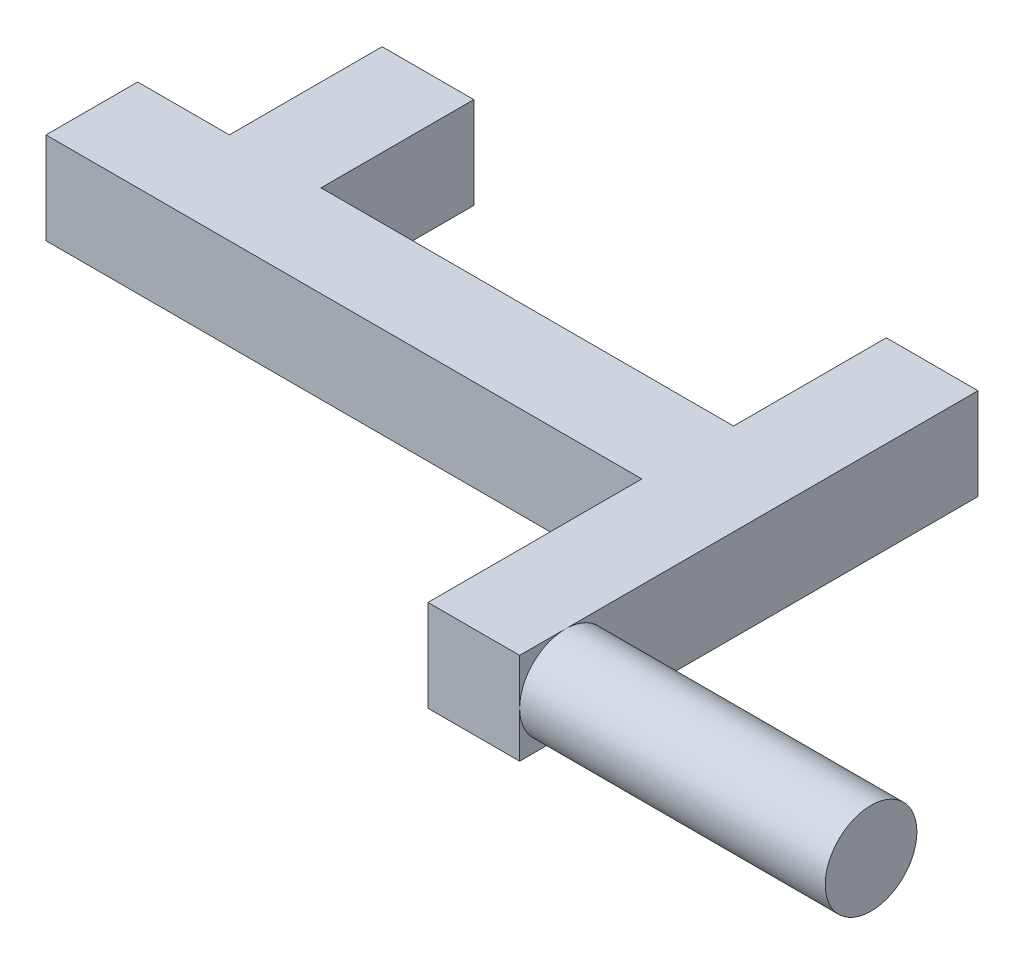
ISO-10303-21;
HEADER;
FILE_DESCRIPTION(('STEP AP214'),'2;1');
FILE_NAME('part.step','',(''),(''),'','','');
FILE_SCHEMA(('AUTOMOTIVE_DESIGN { 1 0 10303 214 1 1 1 1 }'));
ENDSEC;
DATA;
#1=APPLICATION_CONTEXT('core data for automotive mechanical design processes');
#2=APPLICATION_PROTOCOL_DEFINITION('international standard','automotive_design',2000,#1);
#3=PRODUCT_CONTEXT('',#1,'mechanical');
#4=PRODUCT('Part','Part','',(#3));
#5=PRODUCT_RELATED_PRODUCT_CATEGORY('part','',(#4));
#6=PRODUCT_DEFINITION_FORMATION('','',#4);
#7=PRODUCT_DEFINITION_CONTEXT('part definition',#1,'design');
#8=PRODUCT_DEFINITION('design','',#6,#7);
#9=PRODUCT_DEFINITION_SHAPE('','',#8);
#10=(LENGTH_UNIT() NAMED_UNIT(*) SI_UNIT(.MILLI.,.METRE.));
#11=(NAMED_UNIT(*) PLANE_ANGLE_UNIT() SI_UNIT($,.RADIAN.));
#12=(NAMED_UNIT(*) SI_UNIT($,.STERADIAN.) SOLID_ANGLE_UNIT());
#13=UNCERTAINTY_MEASURE_WITH_UNIT(LENGTH_MEASURE(1.E-05),#10,'distance_accuracy_value','');
#14=(GEOMETRIC_REPRESENTATION_CONTEXT(3) GLOBAL_UNCERTAINTY_ASSIGNED_CONTEXT((#13)) GLOBAL_UNIT_ASSIGNED_CONTEXT((#10,
#11,#12)) REPRESENTATION_CONTEXT('',''));
#15=CARTESIAN_POINT('',(0.,0.,0.));
#16=DIRECTION('',(0.,0.,1.));
#17=DIRECTION('',(1.,0.,0.));
#18=AXIS2_PLACEMENT_3D('',#15,#16,#17);
#19=CARTESIAN_POINT('',(71.,6.,0.));
#20=DIRECTION('',(1.,0.,0.));
#21=DIRECTION('',(0.,0.,-1.));
#22=AXIS2_PLACEMENT_3D('',#19,#20,#21);
#23=PLANE('',#22);
#24=CARTESIAN_POINT('',(71.,3.,27.));
#25=DIRECTION('',(1.,0.,0.));
#26=DIRECTION('',(0.,0.,-1.));
#27=AXIS2_PLACEMENT_3D('',#24,#25,#26);
#28=CIRCLE('',#27,3.);
#29=CARTESIAN_POINT('',(71.,3.,24.));
#30=VERTEX_POINT('',#29);
#31=EDGE_CURVE('E328',#30,#30,#28,.T.);
#32=ORIENTED_EDGE('',*,*,#31,.T.);
#33=EDGE_LOOP('',(#32));
#34=FACE_BOUND('',#33,.T.);
#35=ADVANCED_FACE('F107',(#34),#23,.T.);
#36=CARTESIAN_POINT('',(0.,6.,30.));
#37=DIRECTION('',(0.,0.,1.));
#38=DIRECTION('',(1.,0.,0.));
#39=AXIS2_PLACEMENT_3D('',#36,#37,#38);
#40=PLANE('',#39);
#41=DIRECTION('',(-1.,0.,0.));
#42=VECTOR('',#41,1.);
#43=CARTESIAN_POINT('',(0.,0.,30.));
#44=LINE('',#43,#42);
#45=CARTESIAN_POINT('',(51.,0.,30.));
#46=VERTEX_POINT('',#45);
#47=CARTESIAN_POINT('',(45.,0.,30.));
#48=VERTEX_POINT('',#47);
#49=EDGE_CURVE('E243',#46,#48,#44,.T.);
#50=ORIENTED_EDGE('',*,*,#49,.F.);
#51=DIRECTION('',(0.,1.,0.));
#52=VECTOR('',#51,1.);
#53=CARTESIAN_POINT('',(51.,0.,30.));
#54=LINE('',#53,#52);
#55=CARTESIAN_POINT('',(51.,3.,30.));
#56=VERTEX_POINT('',#55);
#57=EDGE_CURVE('E334',#46,#56,#54,.T.);
#58=ORIENTED_EDGE('',*,*,#57,.T.);
#59=DIRECTION('',(0.,1.,0.));
#60=VECTOR('',#59,1.);
#61=CARTESIAN_POINT('',(51.,0.,30.));
#62=LINE('',#61,#60);
#63=CARTESIAN_POINT('',(51.,6.,30.));
#64=VERTEX_POINT('',#63);
#65=EDGE_CURVE('E234',#56,#64,#62,.T.);
#66=ORIENTED_EDGE('',*,*,#65,.T.);
#67=DIRECTION('',(-1.,0.,0.));
#68=VECTOR('',#67,1.);
#69=CARTESIAN_POINT('',(0.,6.,30.));
#70=LINE('',#69,#68);
#71=CARTESIAN_POINT('',(45.,6.,30.));
#72=VERTEX_POINT('',#71);
#73=EDGE_CURVE('E302',#64,#72,#70,.T.);
#74=ORIENTED_EDGE('',*,*,#73,.T.);
#75=DIRECTION('',(0.,-1.,0.));
#76=VECTOR('',#75,1.);
#77=CARTESIAN_POINT('',(45.,6.,30.));
#78=LINE('',#77,#76);
#79=EDGE_CURVE('E273',#72,#48,#78,.T.);
#80=ORIENTED_EDGE('',*,*,#79,.T.);
#81=EDGE_LOOP('',(#50,#58,#66,#74,#80));
#82=FACE_BOUND('',#81,.T.);
#83=ADVANCED_FACE('F365',(#82),#40,.T.);
#84=CARTESIAN_POINT('',(0.,0.,0.));
#85=DIRECTION('',(0.,1.,0.));
#86=DIRECTION('',(0.,0.,1.));
#87=AXIS2_PLACEMENT_3D('',#84,#85,#86);
#88=PLANE('',#87);
#89=DIRECTION('',(0.,0.,1.));
#90=VECTOR('',#89,1.);
#91=CARTESIAN_POINT('',(51.,0.,0.));
#92=LINE('',#91,#90);
#93=CARTESIAN_POINT('',(51.,0.,27.));
#94=VERTEX_POINT('',#93);
#95=EDGE_CURVE('E331',#94,#46,#92,.T.);
#96=ORIENTED_EDGE('',*,*,#95,.T.);
#97=ORIENTED_EDGE('',*,*,#49,.T.);
#98=DIRECTION('',(0.,0.,-1.));
#99=VECTOR('',#98,1.);
#100=CARTESIAN_POINT('',(45.,0.,0.));
#101=LINE('',#100,#99);
#102=CARTESIAN_POINT('',(45.,0.,16.));
#103=VERTEX_POINT('',#102);
#104=EDGE_CURVE('E240',#48,#103,#101,.T.);
#105=ORIENTED_EDGE('',*,*,#104,.T.);
#106=DIRECTION('',(-1.,0.,0.));
#107=VECTOR('',#106,1.);
#108=CARTESIAN_POINT('',(0.,0.,16.));
#109=LINE('',#108,#107);
#110=CARTESIAN_POINT('',(6.00000000000001,0.,16.));
#111=VERTEX_POINT('',#110);
#112=EDGE_CURVE('E237',#103,#111,#109,.T.);
#113=ORIENTED_EDGE('',*,*,#112,.T.);
#114=DIRECTION('',(0.,0.,1.));
#115=VECTOR('',#114,1.);
#116=CARTESIAN_POINT('',(6.,0.,0.));
#117=LINE('',#116,#115);
#118=CARTESIAN_POINT('',(6.,0.,10.));
#119=VERTEX_POINT('',#118);
#120=EDGE_CURVE('E233',#119,#111,#117,.T.);
#121=ORIENTED_EDGE('',*,*,#120,.F.);
#122=DIRECTION('',(1.,0.,0.));
#123=VECTOR('',#122,1.);
#124=CARTESIAN_POINT('',(0.,0.,10.));
#125=LINE('',#124,#123);
#126=CARTESIAN_POINT('',(12.,0.,10.));
#127=VERTEX_POINT('',#126);
#128=EDGE_CURVE('E231',#119,#127,#125,.T.);
#129=ORIENTED_EDGE('',*,*,#128,.T.);
#130=DIRECTION('',(0.,0.,-1.));
#131=VECTOR('',#130,1.);
#132=CARTESIAN_POINT('',(12.,0.,0.));
#133=LINE('',#132,#131);
#134=CARTESIAN_POINT('',(12.,0.,0.));
#135=VERTEX_POINT('',#134);
#136=EDGE_CURVE('E260',#127,#135,#133,.T.);
#137=ORIENTED_EDGE('',*,*,#136,.T.);
#138=DIRECTION('',(1.,0.,0.));
#139=VECTOR('',#138,1.);
#140=CARTESIAN_POINT('',(0.,0.,0.));
#141=LINE('',#140,#139);
#142=CARTESIAN_POINT('',(18.,0.,0.));
#143=VERTEX_POINT('',#142);
#144=EDGE_CURVE('E258',#135,#143,#141,.T.);
#145=ORIENTED_EDGE('',*,*,#144,.T.);
#146=DIRECTION('',(0.,0.,1.));
#147=VECTOR('',#146,1.);
#148=CARTESIAN_POINT('',(18.,0.,0.));
#149=LINE('',#148,#147);
#150=CARTESIAN_POINT('',(18.,0.,10.));
#151=VERTEX_POINT('',#150);
#152=EDGE_CURVE('E206',#143,#151,#149,.T.);
#153=ORIENTED_EDGE('',*,*,#152,.T.);
#154=DIRECTION('',(1.,0.,0.));
#155=VECTOR('',#154,1.);
#156=CARTESIAN_POINT('',(0.,0.,10.));
#157=LINE('',#156,#155);
#158=CARTESIAN_POINT('',(45.,0.,10.));
#159=VERTEX_POINT('',#158);
#160=EDGE_CURVE('E254',#151,#159,#157,.T.);
#161=ORIENTED_EDGE('',*,*,#160,.T.);
#162=DIRECTION('',(0.,0.,-1.));
#163=VECTOR('',#162,1.);
#164=CARTESIAN_POINT('',(45.,0.,0.));
#165=LINE('',#164,#163);
#166=CARTESIAN_POINT('',(45.,0.,0.));
#167=VERTEX_POINT('',#166);
#168=EDGE_CURVE('E251',#159,#167,#165,.T.);
#169=ORIENTED_EDGE('',*,*,#168,.T.);
#170=DIRECTION('',(1.,0.,0.));
#171=VECTOR('',#170,1.);
#172=CARTESIAN_POINT('',(0.,0.,0.));
#173=LINE('',#172,#171);
#174=CARTESIAN_POINT('',(51.,0.,0.));
#175=VERTEX_POINT('',#174);
#176=EDGE_CURVE('E248',#167,#175,#173,.T.);
#177=ORIENTED_EDGE('',*,*,#176,.T.);
#178=DIRECTION('',(0.,0.,1.));
#179=VECTOR('',#178,1.);
#180=CARTESIAN_POINT('',(51.,0.,0.));
#181=LINE('',#180,#179);
#182=EDGE_CURVE('E245',#175,#94,#181,.T.);
#183=ORIENTED_EDGE('',*,*,#182,.T.);
#184=EDGE_LOOP('',(#96,#97,#105,#113,#121,#129,#137,#145,#153,#161,#169,#177,#183));
#185=FACE_BOUND('',#184,.T.);
#186=ADVANCED_FACE('F289',(#185),#88,.F.);
#187=CARTESIAN_POINT('',(0.,6.,0.));
#188=DIRECTION('',(0.,1.,0.));
#189=DIRECTION('',(0.,0.,1.));
#190=AXIS2_PLACEMENT_3D('',#187,#188,#189);
#191=PLANE('',#190);
#192=DIRECTION('',(0.,0.,-1.));
#193=VECTOR('',#192,1.);
#194=CARTESIAN_POINT('',(51.,5.99999999999997,0.));
#195=LINE('',#194,#193);
#196=CARTESIAN_POINT('',(51.,6.,27.));
#197=VERTEX_POINT('',#196);
#198=EDGE_CURVE('E322',#64,#197,#195,.T.);
#199=ORIENTED_EDGE('',*,*,#198,.T.);
#200=DIRECTION('',(0.,0.,1.));
#201=VECTOR('',#200,1.);
#202=CARTESIAN_POINT('',(51.,6.,0.));
#203=LINE('',#202,#201);
#204=CARTESIAN_POINT('',(51.,6.,0.));
#205=VERTEX_POINT('',#204);
#206=EDGE_CURVE('E122',#205,#197,#203,.T.);
#207=ORIENTED_EDGE('',*,*,#206,.F.);
#208=DIRECTION('',(1.,0.,0.));
#209=VECTOR('',#208,1.);
#210=CARTESIAN_POINT('',(0.,6.,0.));
#211=LINE('',#210,#209);
#212=CARTESIAN_POINT('',(45.,6.,0.));
#213=VERTEX_POINT('',#212);
#214=EDGE_CURVE('E309',#213,#205,#211,.T.);
#215=ORIENTED_EDGE('',*,*,#214,.F.);
#216=DIRECTION('',(0.,0.,-1.));
#217=VECTOR('',#216,1.);
#218=CARTESIAN_POINT('',(45.,6.,0.));
#219=LINE('',#218,#217);
#220=CARTESIAN_POINT('',(45.,6.,10.));
#221=VERTEX_POINT('',#220);
#222=EDGE_CURVE('E312',#221,#213,#219,.T.);
#223=ORIENTED_EDGE('',*,*,#222,.F.);
#224=DIRECTION('',(1.,0.,0.));
#225=VECTOR('',#224,1.);
#226=CARTESIAN_POINT('',(0.,6.,10.));
#227=LINE('',#226,#225);
#228=CARTESIAN_POINT('',(18.,6.,10.));
#229=VERTEX_POINT('',#228);
#230=EDGE_CURVE('E223',#229,#221,#227,.T.);
#231=ORIENTED_EDGE('',*,*,#230,.F.);
#232=DIRECTION('',(0.,0.,1.));
#233=VECTOR('',#232,1.);
#234=CARTESIAN_POINT('',(18.,6.,0.));
#235=LINE('',#234,#233);
#236=CARTESIAN_POINT('',(18.,6.,0.));
#237=VERTEX_POINT('',#236);
#238=EDGE_CURVE('E204',#237,#229,#235,.T.);
#239=ORIENTED_EDGE('',*,*,#238,.F.);
#240=DIRECTION('',(1.,0.,0.));
#241=VECTOR('',#240,1.);
#242=CARTESIAN_POINT('',(0.,6.,0.));
#243=LINE('',#242,#241);
#244=CARTESIAN_POINT('',(12.,6.,0.));
#245=VERTEX_POINT('',#244);
#246=EDGE_CURVE('E220',#245,#237,#243,.T.);
#247=ORIENTED_EDGE('',*,*,#246,.F.);
#248=DIRECTION('',(0.,0.,-1.));
#249=VECTOR('',#248,1.);
#250=CARTESIAN_POINT('',(12.,6.,0.));
#251=LINE('',#250,#249);
#252=CARTESIAN_POINT('',(12.,6.,10.));
#253=VERTEX_POINT('',#252);
#254=EDGE_CURVE('E226',#253,#245,#251,.T.);
#255=ORIENTED_EDGE('',*,*,#254,.F.);
#256=DIRECTION('',(1.,0.,0.));
#257=VECTOR('',#256,1.);
#258=CARTESIAN_POINT('',(0.,6.,10.));
#259=LINE('',#258,#257);
#260=CARTESIAN_POINT('',(6.,6.,10.));
#261=VERTEX_POINT('',#260);
#262=EDGE_CURVE('E263',#261,#253,#259,.T.);
#263=ORIENTED_EDGE('',*,*,#262,.F.);
#264=DIRECTION('',(0.,0.,1.));
#265=VECTOR('',#264,1.);
#266=CARTESIAN_POINT('',(6.,6.,0.));
#267=LINE('',#266,#265);
#268=CARTESIAN_POINT('',(6.00000000000001,6.,16.));
#269=VERTEX_POINT('',#268);
#270=EDGE_CURVE('E300',#261,#269,#267,.T.);
#271=ORIENTED_EDGE('',*,*,#270,.T.);
#272=DIRECTION('',(-1.,0.,0.));
#273=VECTOR('',#272,1.);
#274=CARTESIAN_POINT('',(0.,6.,16.));
#275=LINE('',#274,#273);
#276=CARTESIAN_POINT('',(45.,6.,16.));
#277=VERTEX_POINT('',#276);
#278=EDGE_CURVE('E283',#277,#269,#275,.T.);
#279=ORIENTED_EDGE('',*,*,#278,.F.);
#280=DIRECTION('',(0.,0.,-1.));
#281=VECTOR('',#280,1.);
#282=CARTESIAN_POINT('',(45.,6.,0.));
#283=LINE('',#282,#281);
#284=EDGE_CURVE('E297',#72,#277,#283,.T.);
#285=ORIENTED_EDGE('',*,*,#284,.F.);
#286=ORIENTED_EDGE('',*,*,#73,.F.);
#287=EDGE_LOOP('',(#199,#207,#215,#223,#231,#239,#247,#255,#263,#271,#279,#285,#286));
#288=FACE_BOUND('',#287,.T.);
#289=ADVANCED_FACE('F218',(#288),#191,.T.);
#290=CARTESIAN_POINT('',(0.,6.,10.));
#291=DIRECTION('',(0.,0.,-1.));
#292=DIRECTION('',(-1.,0.,0.));
#293=AXIS2_PLACEMENT_3D('',#290,#291,#292);
#294=PLANE('',#293);
#295=ORIENTED_EDGE('',*,*,#128,.F.);
#296=DIRECTION('',(0.,-1.,0.));
#297=VECTOR('',#296,1.);
#298=CARTESIAN_POINT('',(6.,6.,10.));
#299=LINE('',#298,#297);
#300=EDGE_CURVE('E12',#261,#119,#299,.T.);
#301=ORIENTED_EDGE('',*,*,#300,.F.);
#302=ORIENTED_EDGE('',*,*,#262,.T.);
#303=DIRECTION('',(0.,-1.,0.));
#304=VECTOR('',#303,1.);
#305=CARTESIAN_POINT('',(12.,6.,10.));
#306=LINE('',#305,#304);
#307=EDGE_CURVE('E131',#253,#127,#306,.T.);
#308=ORIENTED_EDGE('',*,*,#307,.T.);
#309=EDGE_LOOP('',(#295,#301,#302,#308));
#310=FACE_BOUND('',#309,.T.);
#311=ADVANCED_FACE('F109',(#310),#294,.T.);
#312=CARTESIAN_POINT('',(6.,6.,0.));
#313=DIRECTION('',(1.,0.,0.));
#314=DIRECTION('',(0.,0.,-1.));
#315=AXIS2_PLACEMENT_3D('',#312,#313,#314);
#316=PLANE('',#315);
#317=ORIENTED_EDGE('',*,*,#120,.T.);
#318=DIRECTION('',(0.,-1.,0.));
#319=VECTOR('',#318,1.);
#320=CARTESIAN_POINT('',(6.00000000000001,6.,16.));
#321=LINE('',#320,#319);
#322=EDGE_CURVE('E115',#269,#111,#321,.T.);
#323=ORIENTED_EDGE('',*,*,#322,.F.);
#324=ORIENTED_EDGE('',*,*,#270,.F.);
#325=ORIENTED_EDGE('',*,*,#300,.T.);
#326=EDGE_LOOP('',(#317,#323,#324,#325));
#327=FACE_BOUND('',#326,.T.);
#328=ADVANCED_FACE('F286',(#327),#316,.F.);
#329=CARTESIAN_POINT('',(0.,6.,16.));
#330=DIRECTION('',(0.,0.,1.));
#331=DIRECTION('',(1.,0.,0.));
#332=AXIS2_PLACEMENT_3D('',#329,#330,#331);
#333=PLANE('',#332);
#334=ORIENTED_EDGE('',*,*,#112,.F.);
#335=DIRECTION('',(0.,-1.,0.));
#336=VECTOR('',#335,1.);
#337=CARTESIAN_POINT('',(45.,6.,16.));
#338=LINE('',#337,#336);
#339=EDGE_CURVE('E276',#277,#103,#338,.T.);
#340=ORIENTED_EDGE('',*,*,#339,.F.);
#341=ORIENTED_EDGE('',*,*,#278,.T.);
#342=ORIENTED_EDGE('',*,*,#322,.T.);
#343=EDGE_LOOP('',(#334,#340,#341,#342));
#344=FACE_BOUND('',#343,.T.);
#345=ADVANCED_FACE('F281',(#344),#333,.T.);
#346=CARTESIAN_POINT('',(45.,6.,0.));
#347=DIRECTION('',(-1.,0.,0.));
#348=DIRECTION('',(0.,0.,1.));
#349=AXIS2_PLACEMENT_3D('',#346,#347,#348);
#350=PLANE('',#349);
#351=ORIENTED_EDGE('',*,*,#104,.F.);
#352=ORIENTED_EDGE('',*,*,#79,.F.);
#353=ORIENTED_EDGE('',*,*,#284,.T.);
#354=ORIENTED_EDGE('',*,*,#339,.T.);
#355=EDGE_LOOP('',(#351,#352,#353,#354));
#356=FACE_BOUND('',#355,.T.);
#357=ADVANCED_FACE('F294',(#356),#350,.T.);
#358=CARTESIAN_POINT('',(51.,6.,0.));
#359=DIRECTION('',(1.,0.,0.));
#360=DIRECTION('',(0.,0.,-1.));
#361=AXIS2_PLACEMENT_3D('',#358,#359,#360);
#362=PLANE('',#361);
#363=ORIENTED_EDGE('',*,*,#182,.F.);
#364=DIRECTION('',(0.,-1.,0.));
#365=VECTOR('',#364,1.);
#366=CARTESIAN_POINT('',(51.,6.,0.));
#367=LINE('',#366,#365);
#368=EDGE_CURVE('E271',#205,#175,#367,.T.);
#369=ORIENTED_EDGE('',*,*,#368,.F.);
#370=ORIENTED_EDGE('',*,*,#206,.T.);
#371=CARTESIAN_POINT('',(51.,3.,27.));
#372=DIRECTION('',(1.,0.,0.));
#373=DIRECTION('',(0.,0.,-1.));
#374=AXIS2_PLACEMENT_3D('',#371,#372,#373);
#375=CIRCLE('',#374,3.);
#376=EDGE_CURVE('E327',#94,#197,#375,.T.);
#377=ORIENTED_EDGE('',*,*,#376,.F.);
#378=EDGE_LOOP('',(#363,#369,#370,#377));
#379=FACE_BOUND('',#378,.T.);
#380=ADVANCED_FACE('F351',(#379),#362,.T.);
#381=CARTESIAN_POINT('',(0.,6.,0.));
#382=DIRECTION('',(0.,0.,-1.));
#383=DIRECTION('',(-1.,0.,0.));
#384=AXIS2_PLACEMENT_3D('',#381,#382,#383);
#385=PLANE('',#384);
#386=ORIENTED_EDGE('',*,*,#176,.F.);
#387=DIRECTION('',(0.,-1.,0.));
#388=VECTOR('',#387,1.);
#389=CARTESIAN_POINT('',(45.,6.,0.));
#390=LINE('',#389,#388);
#391=EDGE_CURVE('E269',#213,#167,#390,.T.);
#392=ORIENTED_EDGE('',*,*,#391,.F.);
#393=ORIENTED_EDGE('',*,*,#214,.T.);
#394=ORIENTED_EDGE('',*,*,#368,.T.);
#395=EDGE_LOOP('',(#386,#392,#393,#394));
#396=FACE_BOUND('',#395,.T.);
#397=ADVANCED_FACE('F353',(#396),#385,.T.);
#398=CARTESIAN_POINT('',(45.,6.,0.));
#399=DIRECTION('',(-1.,0.,0.));
#400=DIRECTION('',(0.,0.,1.));
#401=AXIS2_PLACEMENT_3D('',#398,#399,#400);
#402=PLANE('',#401);
#403=ORIENTED_EDGE('',*,*,#168,.F.);
#404=DIRECTION('',(0.,-1.,0.));
#405=VECTOR('',#404,1.);
#406=CARTESIAN_POINT('',(45.,6.,10.));
#407=LINE('',#406,#405);
#408=EDGE_CURVE('E267',#221,#159,#407,.T.);
#409=ORIENTED_EDGE('',*,*,#408,.F.);
#410=ORIENTED_EDGE('',*,*,#222,.T.);
#411=ORIENTED_EDGE('',*,*,#391,.T.);
#412=EDGE_LOOP('',(#403,#409,#410,#411));
#413=FACE_BOUND('',#412,.T.);
#414=ADVANCED_FACE('F359',(#413),#402,.T.);
#415=CARTESIAN_POINT('',(0.,6.,10.));
#416=DIRECTION('',(0.,0.,-1.));
#417=DIRECTION('',(-1.,0.,0.));
#418=AXIS2_PLACEMENT_3D('',#415,#416,#417);
#419=PLANE('',#418);
#420=ORIENTED_EDGE('',*,*,#160,.F.);
#421=DIRECTION('',(0.,-1.,0.));
#422=VECTOR('',#421,1.);
#423=CARTESIAN_POINT('',(18.,6.,10.));
#424=LINE('',#423,#422);
#425=EDGE_CURVE('E211',#229,#151,#424,.T.);
#426=ORIENTED_EDGE('',*,*,#425,.F.);
#427=ORIENTED_EDGE('',*,*,#230,.T.);
#428=ORIENTED_EDGE('',*,*,#408,.T.);
#429=EDGE_LOOP('',(#420,#426,#427,#428));
#430=FACE_BOUND('',#429,.T.);
#431=ADVANCED_FACE('F316',(#430),#419,.T.);
#432=CARTESIAN_POINT('',(18.,6.,0.));
#433=DIRECTION('',(1.,0.,0.));
#434=DIRECTION('',(0.,0.,-1.));
#435=AXIS2_PLACEMENT_3D('',#432,#433,#434);
#436=PLANE('',#435);
#437=ORIENTED_EDGE('',*,*,#152,.F.);
#438=DIRECTION('',(0.,-1.,0.));
#439=VECTOR('',#438,1.);
#440=CARTESIAN_POINT('',(18.,6.,0.));
#441=LINE('',#440,#439);
#442=EDGE_CURVE('E201',#237,#143,#441,.T.);
#443=ORIENTED_EDGE('',*,*,#442,.F.);
#444=ORIENTED_EDGE('',*,*,#238,.T.);
#445=ORIENTED_EDGE('',*,*,#425,.T.);
#446=EDGE_LOOP('',(#437,#443,#444,#445));
#447=FACE_BOUND('',#446,.T.);
#448=ADVANCED_FACE('F203',(#447),#436,.T.);
#449=CARTESIAN_POINT('',(0.,6.,0.));
#450=DIRECTION('',(0.,0.,-1.));
#451=DIRECTION('',(-1.,0.,0.));
#452=AXIS2_PLACEMENT_3D('',#449,#450,#451);
#453=PLANE('',#452);
#454=ORIENTED_EDGE('',*,*,#144,.F.);
#455=DIRECTION('',(0.,-1.,0.));
#456=VECTOR('',#455,1.);
#457=CARTESIAN_POINT('',(12.,6.,0.));
#458=LINE('',#457,#456);
#459=EDGE_CURVE('E212',#245,#135,#458,.T.);
#460=ORIENTED_EDGE('',*,*,#459,.F.);
#461=ORIENTED_EDGE('',*,*,#246,.T.);
#462=ORIENTED_EDGE('',*,*,#442,.T.);
#463=EDGE_LOOP('',(#454,#460,#461,#462));
#464=FACE_BOUND('',#463,.T.);
#465=ADVANCED_FACE('F225',(#464),#453,.T.);
#466=CARTESIAN_POINT('',(12.,6.,0.));
#467=DIRECTION('',(-1.,0.,0.));
#468=DIRECTION('',(0.,0.,1.));
#469=AXIS2_PLACEMENT_3D('',#466,#467,#468);
#470=PLANE('',#469);
#471=ORIENTED_EDGE('',*,*,#136,.F.);
#472=ORIENTED_EDGE('',*,*,#307,.F.);
#473=ORIENTED_EDGE('',*,*,#254,.T.);
#474=ORIENTED_EDGE('',*,*,#459,.T.);
#475=EDGE_LOOP('',(#471,#472,#473,#474));
#476=FACE_BOUND('',#475,.T.);
#477=ADVANCED_FACE('F318',(#476),#470,.T.);
#478=CARTESIAN_POINT('',(51.,3.,27.));
#479=DIRECTION('',(1.,0.,0.));
#480=DIRECTION('',(0.,0.,-1.));
#481=AXIS2_PLACEMENT_3D('',#478,#479,#480);
#482=CYLINDRICAL_SURFACE('',#481,3.);
#483=ORIENTED_EDGE('',*,*,#31,.F.);
#484=EDGE_LOOP('',(#483));
#485=FACE_BOUND('',#484,.T.);
#486=CARTESIAN_POINT('',(51.,3.,27.));
#487=DIRECTION('',(1.,0.,0.));
#488=DIRECTION('',(0.,0.,-1.));
#489=AXIS2_PLACEMENT_3D('',#486,#487,#488);
#490=CIRCLE('',#489,3.);
#491=EDGE_CURVE('E337',#56,#94,#490,.T.);
#492=ORIENTED_EDGE('',*,*,#491,.T.);
#493=ORIENTED_EDGE('',*,*,#376,.T.);
#494=CARTESIAN_POINT('',(51.,3.,27.));
#495=DIRECTION('',(1.,0.,0.));
#496=DIRECTION('',(0.,0.,-1.));
#497=AXIS2_PLACEMENT_3D('',#494,#495,#496);
#498=CIRCLE('',#497,3.);
#499=EDGE_CURVE('E324',#197,#56,#498,.T.);
#500=ORIENTED_EDGE('',*,*,#499,.T.);
#501=EDGE_LOOP('',(#492,#493,#500));
#502=FACE_BOUND('',#501,.T.);
#503=ADVANCED_FACE('F342',(#485,#502),#482,.T.);
#504=CARTESIAN_POINT('',(51.,0.,0.));
#505=DIRECTION('',(1.,0.,0.));
#506=DIRECTION('',(0.,0.,-1.));
#507=AXIS2_PLACEMENT_3D('',#504,#505,#506);
#508=PLANE('',#507);
#509=ORIENTED_EDGE('',*,*,#499,.F.);
#510=ORIENTED_EDGE('',*,*,#198,.F.);
#511=ORIENTED_EDGE('',*,*,#65,.F.);
#512=EDGE_LOOP('',(#509,#510,#511));
#513=FACE_BOUND('',#512,.T.);
#514=ADVANCED_FACE('F387',(#513),#508,.T.);
#515=CARTESIAN_POINT('',(51.,0.,0.));
#516=DIRECTION('',(1.,0.,0.));
#517=DIRECTION('',(0.,0.,-1.));
#518=AXIS2_PLACEMENT_3D('',#515,#516,#517);
#519=PLANE('',#518);
#520=ORIENTED_EDGE('',*,*,#491,.F.);
#521=ORIENTED_EDGE('',*,*,#57,.F.);
#522=ORIENTED_EDGE('',*,*,#95,.F.);
#523=EDGE_LOOP('',(#520,#521,#522));
#524=FACE_BOUND('',#523,.T.);
#525=ADVANCED_FACE('F407',(#524),#519,.T.);
#526=CLOSED_SHELL('',(#35,#83,#186,#289,#311,#328,#345,#357,#380,#397,#414,#431,#448,#465,#477,
#503,#514,#525));
#527=MANIFOLD_SOLID_BREP('B2',#526);
#528=ADVANCED_BREP_SHAPE_REPRESENTATION('',(#18,#527),#14);
#529=SHAPE_DEFINITION_REPRESENTATION(#9,#528);
ENDSEC;
END-ISO-10303-21;
